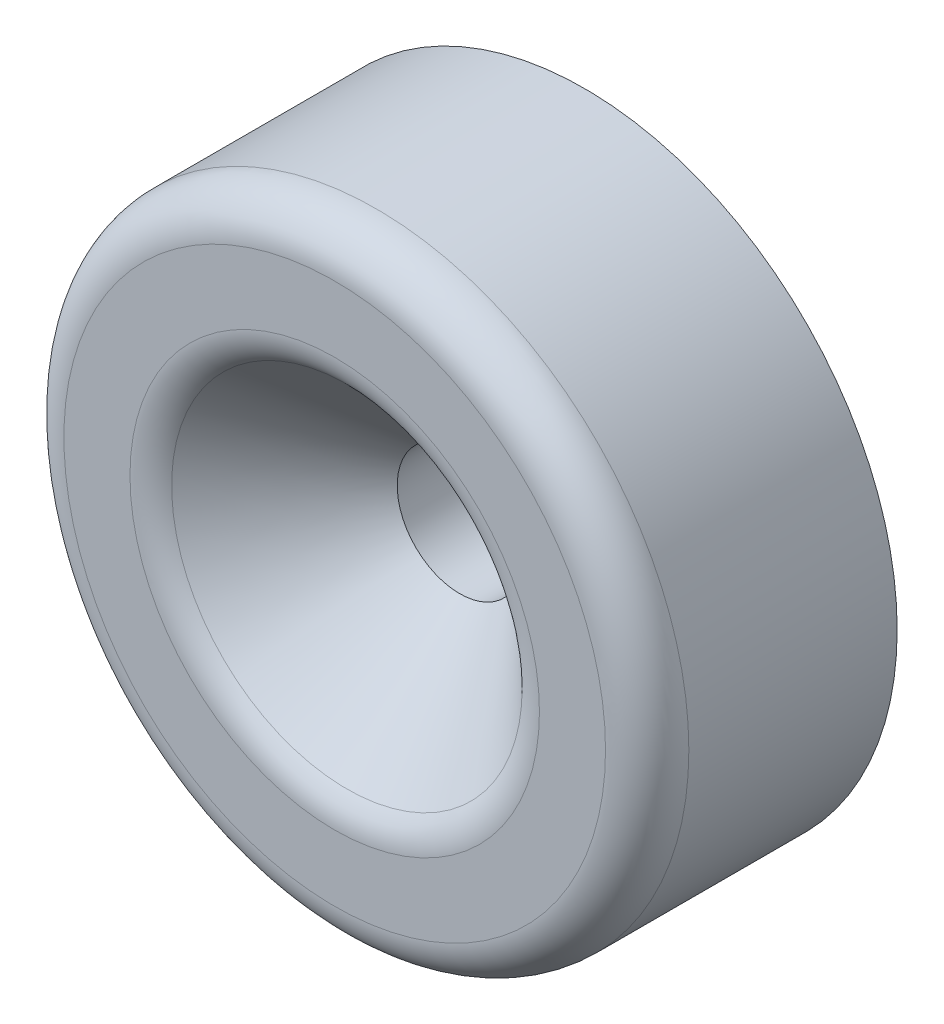
ISO-10303-21;
HEADER;
FILE_DESCRIPTION(('STEP AP214'),'2;1');
FILE_NAME('part.step','',(''),(''),'','','');
FILE_SCHEMA(('AUTOMOTIVE_DESIGN { 1 0 10303 214 1 1 1 1 }'));
ENDSEC;
DATA;
#1=APPLICATION_CONTEXT('core data for automotive mechanical design processes');
#2=APPLICATION_PROTOCOL_DEFINITION('international standard','automotive_design',2000,#1);
#3=PRODUCT_CONTEXT('',#1,'mechanical');
#4=PRODUCT('Part','Part','',(#3));
#5=PRODUCT_RELATED_PRODUCT_CATEGORY('part','',(#4));
#6=PRODUCT_DEFINITION_FORMATION('','',#4);
#7=PRODUCT_DEFINITION_CONTEXT('part definition',#1,'design');
#8=PRODUCT_DEFINITION('design','',#6,#7);
#9=PRODUCT_DEFINITION_SHAPE('','',#8);
#10=(LENGTH_UNIT() NAMED_UNIT(*) SI_UNIT(.MILLI.,.METRE.));
#11=(NAMED_UNIT(*) PLANE_ANGLE_UNIT() SI_UNIT($,.RADIAN.));
#12=(NAMED_UNIT(*) SI_UNIT($,.STERADIAN.) SOLID_ANGLE_UNIT());
#13=UNCERTAINTY_MEASURE_WITH_UNIT(LENGTH_MEASURE(1.E-05),#10,'distance_accuracy_value','');
#14=(GEOMETRIC_REPRESENTATION_CONTEXT(3) GLOBAL_UNCERTAINTY_ASSIGNED_CONTEXT((#13)) GLOBAL_UNIT_ASSIGNED_CONTEXT((#10,
#11,#12)) REPRESENTATION_CONTEXT('',''));
#15=CARTESIAN_POINT('',(0.,0.,0.));
#16=DIRECTION('',(0.,0.,1.));
#17=DIRECTION('',(1.,0.,0.));
#18=AXIS2_PLACEMENT_3D('',#15,#16,#17);
#19=CARTESIAN_POINT('',(0.,0.,12.));
#20=DIRECTION('',(0.,0.,1.));
#21=DIRECTION('',(1.,0.,0.));
#22=AXIS2_PLACEMENT_3D('',#19,#20,#21);
#23=PLANE('',#22);
#24=CARTESIAN_POINT('',(0.,0.,12.));
#25=DIRECTION('',(0.,0.,1.));
#26=DIRECTION('',(1.,0.,0.));
#27=AXIS2_PLACEMENT_3D('',#24,#25,#26);
#28=CIRCLE('',#27,13.);
#29=CARTESIAN_POINT('',(13.,0.,12.));
#30=VERTEX_POINT('',#29);
#31=EDGE_CURVE('E44',#30,#30,#28,.T.);
#32=ORIENTED_EDGE('',*,*,#31,.T.);
#33=EDGE_LOOP('',(#32));
#34=FACE_BOUND('',#33,.T.);
#35=CARTESIAN_POINT('',(0.,0.,12.));
#36=DIRECTION('',(0.,0.,1.));
#37=DIRECTION('',(1.,0.,0.));
#38=AXIS2_PLACEMENT_3D('',#35,#36,#37);
#39=CIRCLE('',#38,9.82842712474621);
#40=CARTESIAN_POINT('',(9.82842712474621,0.,12.));
#41=VERTEX_POINT('',#40);
#42=EDGE_CURVE('E48',#41,#41,#39,.F.);
#43=ORIENTED_EDGE('',*,*,#42,.T.);
#44=EDGE_LOOP('',(#43));
#45=FACE_BOUND('',#44,.T.);
#46=ADVANCED_FACE('F33',(#34,#45),#23,.T.);
#47=CARTESIAN_POINT('',(0.,0.,0.));
#48=DIRECTION('',(0.,0.,1.));
#49=DIRECTION('',(1.,0.,0.));
#50=AXIS2_PLACEMENT_3D('',#47,#48,#49);
#51=PLANE('',#50);
#52=CARTESIAN_POINT('',(0.,0.,0.));
#53=DIRECTION('',(0.,0.,1.));
#54=DIRECTION('',(1.,0.,0.));
#55=AXIS2_PLACEMENT_3D('',#52,#53,#54);
#56=CIRCLE('',#55,15.);
#57=CARTESIAN_POINT('',(15.,0.,0.));
#58=VERTEX_POINT('',#57);
#59=EDGE_CURVE('E56',#58,#58,#56,.T.);
#60=ORIENTED_EDGE('',*,*,#59,.F.);
#61=EDGE_LOOP('',(#60));
#62=FACE_BOUND('',#61,.T.);
#63=CARTESIAN_POINT('',(0.,0.,0.));
#64=DIRECTION('',(0.,0.,1.));
#65=DIRECTION('',(1.,0.,0.));
#66=AXIS2_PLACEMENT_3D('',#63,#64,#65);
#67=CIRCLE('',#66,3.);
#68=CARTESIAN_POINT('',(3.,0.,0.));
#69=VERTEX_POINT('',#68);
#70=EDGE_CURVE('E59',#69,#69,#67,.T.);
#71=ORIENTED_EDGE('',*,*,#70,.T.);
#72=EDGE_LOOP('',(#71));
#73=FACE_BOUND('',#72,.T.);
#74=ADVANCED_FACE('F63',(#62,#73),#51,.F.);
#75=CARTESIAN_POINT('',(0.,0.,12.));
#76=DIRECTION('',(0.,0.,-1.));
#77=DIRECTION('',(-1.,0.,0.));
#78=AXIS2_PLACEMENT_3D('',#75,#76,#77);
#79=CYLINDRICAL_SURFACE('',#78,15.);
#80=CARTESIAN_POINT('',(0.,0.,10.));
#81=DIRECTION('',(0.,0.,1.));
#82=DIRECTION('',(1.,0.,0.));
#83=AXIS2_PLACEMENT_3D('',#80,#81,#82);
#84=CIRCLE('',#83,15.);
#85=CARTESIAN_POINT('',(15.,0.,10.));
#86=VERTEX_POINT('',#85);
#87=EDGE_CURVE('E40',#86,#86,#84,.F.);
#88=ORIENTED_EDGE('',*,*,#87,.T.);
#89=EDGE_LOOP('',(#88));
#90=FACE_BOUND('',#89,.T.);
#91=ORIENTED_EDGE('',*,*,#59,.T.);
#92=EDGE_LOOP('',(#91));
#93=FACE_BOUND('',#92,.T.);
#94=ADVANCED_FACE('F68',(#90,#93),#79,.T.);
#95=CARTESIAN_POINT('',(0.,0.,12.));
#96=DIRECTION('',(0.,0.,-1.));
#97=DIRECTION('',(-1.,0.,0.));
#98=AXIS2_PLACEMENT_3D('',#95,#96,#97);
#99=CYLINDRICAL_SURFACE('',#98,3.);
#100=CARTESIAN_POINT('',(0.,0.,6.));
#101=DIRECTION('',(0.,0.,1.));
#102=DIRECTION('',(1.,0.,0.));
#103=AXIS2_PLACEMENT_3D('',#100,#101,#102);
#104=CIRCLE('',#103,3.);
#105=CARTESIAN_POINT('',(3.,0.,6.));
#106=VERTEX_POINT('',#105);
#107=EDGE_CURVE('E53',#106,#106,#104,.T.);
#108=ORIENTED_EDGE('',*,*,#107,.T.);
#109=EDGE_LOOP('',(#108));
#110=FACE_BOUND('',#109,.T.);
#111=ORIENTED_EDGE('',*,*,#70,.F.);
#112=EDGE_LOOP('',(#111));
#113=FACE_BOUND('',#112,.T.);
#114=ADVANCED_FACE('F65',(#110,#113),#99,.F.);
#115=CARTESIAN_POINT('',(0.,0.,6.));
#116=DIRECTION('',(0.,0.,1.));
#117=DIRECTION('',(1.,0.,0.));
#118=AXIS2_PLACEMENT_3D('',#115,#116,#117);
#119=CONICAL_SURFACE('',#118,3.,0.78539816339745);
#120=CARTESIAN_POINT('',(0.,0.,11.4142135623731));
#121=DIRECTION('',(0.,0.,-1.));
#122=DIRECTION('',(-1.,0.,0.));
#123=AXIS2_PLACEMENT_3D('',#120,#121,#122);
#124=CIRCLE('',#123,8.41421356237312);
#125=CARTESIAN_POINT('',(8.41421356237312,0.,11.4142135623731));
#126=VERTEX_POINT('',#125);
#127=EDGE_CURVE('E10',#126,#126,#124,.F.);
#128=CARTESIAN_POINT('',(8.41421356237312,0.,11.4142135623731));
#129=CARTESIAN_POINT('',(8.35781550443173,0.,11.3578155044317));
#130=CARTESIAN_POINT('',(8.30141744649034,0.,11.3014174464903));
#131=CARTESIAN_POINT('',(8.18862133060757,0.,11.1886213306076));
#132=CARTESIAN_POINT('',(8.13222327266619,0.,11.1322232726662));
#133=CARTESIAN_POINT('',(8.01942715678341,0.,11.0194271567834));
#134=CARTESIAN_POINT('',(7.96302909884202,0.,10.963029098842));
#135=CARTESIAN_POINT('',(7.85023298295925,0.,10.8502329829592));
#136=CARTESIAN_POINT('',(7.79383492501787,0.,10.7938349250178));
#137=CARTESIAN_POINT('',(7.68103880913509,0.,10.6810388091351));
#138=CARTESIAN_POINT('',(7.62464075119371,0.,10.6246407511937));
#139=CARTESIAN_POINT('',(7.51184463531093,0.,10.5118446353109));
#140=CARTESIAN_POINT('',(7.45544657736955,0.,10.4554465773695));
#141=CARTESIAN_POINT('',(7.34265046148677,0.,10.3426504614868));
#142=CARTESIAN_POINT('',(7.28625240354538,0.,10.2862524035454));
#143=CARTESIAN_POINT('',(7.17345628766261,0.,10.1734562876626));
#144=CARTESIAN_POINT('',(7.11705822972122,0.,10.1170582297212));
#145=CARTESIAN_POINT('',(7.00426211383845,0.,10.0042621138384));
#146=CARTESIAN_POINT('',(6.94786405589707,0.,9.94786405589705));
#147=CARTESIAN_POINT('',(6.83506794001429,0.,9.83506794001428));
#148=CARTESIAN_POINT('',(6.77866988207291,0.,9.77866988207289));
#149=CARTESIAN_POINT('',(6.66587376619013,0.,9.66587376619012));
#150=CARTESIAN_POINT('',(6.60947570824875,0.,9.60947570824873));
#151=CARTESIAN_POINT('',(6.49667959236597,0.,9.49667959236596));
#152=CARTESIAN_POINT('',(6.44028153442459,0.,9.44028153442457));
#153=CARTESIAN_POINT('',(6.32748541854181,0.,9.3274854185418));
#154=CARTESIAN_POINT('',(6.27108736060043,0.,9.27108736060041));
#155=CARTESIAN_POINT('',(6.15829124471765,0.,9.15829124471764));
#156=CARTESIAN_POINT('',(6.10189318677627,0.,9.10189318677625));
#157=CARTESIAN_POINT('',(5.98909707089349,0.,8.98909707089348));
#158=CARTESIAN_POINT('',(5.93269901295211,0.,8.93269901295209));
#159=CARTESIAN_POINT('',(5.81990289706933,0.,8.81990289706932));
#160=CARTESIAN_POINT('',(5.76350483912795,0.,8.76350483912793));
#161=CARTESIAN_POINT('',(5.65070872324517,0.,8.65070872324516));
#162=CARTESIAN_POINT('',(5.59431066530379,0.,8.59431066530377));
#163=CARTESIAN_POINT('',(5.48151454942101,0.,8.481514549421));
#164=CARTESIAN_POINT('',(5.42511649147963,0.,8.42511649147962));
#165=CARTESIAN_POINT('',(5.31232037559685,0.,8.31232037559684));
#166=CARTESIAN_POINT('',(5.25592231765547,0.,8.25592231765546));
#167=CARTESIAN_POINT('',(5.14312620177269,0.,8.14312620177268));
#168=CARTESIAN_POINT('',(5.08672814383131,0.,8.0867281438313));
#169=CARTESIAN_POINT('',(4.97393202794853,0.,7.97393202794852));
#170=CARTESIAN_POINT('',(4.91753397000715,0.,7.91753397000714));
#171=CARTESIAN_POINT('',(4.80473785412437,0.,7.80473785412437));
#172=CARTESIAN_POINT('',(4.74833979618299,0.,7.74833979618298));
#173=CARTESIAN_POINT('',(4.63554368030021,0.,7.63554368030021));
#174=CARTESIAN_POINT('',(4.57914562235883,0.,7.57914562235882));
#175=CARTESIAN_POINT('',(4.46634950647605,0.,7.46634950647605));
#176=CARTESIAN_POINT('',(4.40995144853467,0.,7.40995144853466));
#177=CARTESIAN_POINT('',(4.29715533265189,0.,7.29715533265189));
#178=CARTESIAN_POINT('',(4.24075727471051,0.,7.2407572747105));
#179=CARTESIAN_POINT('',(4.12796115882773,0.,7.12796115882773));
#180=CARTESIAN_POINT('',(4.07156310088635,0.,7.07156310088634));
#181=CARTESIAN_POINT('',(3.95876698500357,0.,6.95876698500357));
#182=CARTESIAN_POINT('',(3.90236892706219,0.,6.90236892706218));
#183=CARTESIAN_POINT('',(3.78957281117941,0.,6.78957281117941));
#184=CARTESIAN_POINT('',(3.73317475323803,0.,6.73317475323802));
#185=CARTESIAN_POINT('',(3.62037863735525,0.,6.62037863735525));
#186=CARTESIAN_POINT('',(3.56398057941387,0.,6.56398057941386));
#187=CARTESIAN_POINT('',(3.45118446353109,0.,6.45118446353109));
#188=CARTESIAN_POINT('',(3.39478640558971,0.,6.3947864055897));
#189=CARTESIAN_POINT('',(3.28199028970693,0.,6.28199028970693));
#190=CARTESIAN_POINT('',(3.22559223176555,0.,6.22559223176554));
#191=CARTESIAN_POINT('',(3.11279611588277,0.,6.11279611588277));
#192=CARTESIAN_POINT('',(3.05639805794139,0.,6.05639805794138));
#193=CARTESIAN_POINT('',(3.,0.,6.));
#194=B_SPLINE_CURVE_WITH_KNOTS('',3,(#128,#129,#130,#131,#132,#133,#134,#135,#136,#137,#138,
#139,#140,#141,#142,#143,#144,#145,#146,#147,#148,#149,#150,#151,#152,#153,#154,#155,#156,#157,
#158,#159,#160,#161,#162,#163,#164,#165,#166,#167,#168,#169,#170,#171,#172,#173,#174,#175,#176,
#177,#178,#179,#180,#181,#182,#183,#184,#185,#186,#187,#188,#189,#190,#191,#192,#193),
.UNSPECIFIED.,.F.,.F.,(4,2,2,2,2,2,2,2,2,2,2,2,2,2,2,2,2,2,2,2,2,2,2,2,2,2,2,2,2,2,2,2,4),(0.,
0.239276695296638,0.478553390593275,0.717830085889913,0.957106781186551,1.19638347648319,
1.43566017177983,1.67493686707646,1.9142135623731,2.15349025766974,2.39276695296638,
2.63204364826301,2.87132034355965,3.11059703885629,3.34987373415293,3.58915042944956,
3.8284271247462,4.06770382004284,4.30698051533948,4.54625721063611,4.78553390593275,
5.02481060122939,5.26408729652603,5.50336399182266,5.7426406871193,5.98191738241594,
6.22119407771258,6.46047077300921,6.69974746830585,6.93902416360249,7.17830085889913,
7.41757755419576,7.6568542494924),.UNSPECIFIED.);
#195=EDGE_CURVE('BSEAM67',#126,#106,#194,.T.);
#196=ORIENTED_EDGE('',*,*,#127,.T.);
#197=ORIENTED_EDGE('',*,*,#107,.F.);
#198=ORIENTED_EDGE('',*,*,#195,.T.);
#199=ORIENTED_EDGE('',*,*,#195,.F.);
#200=EDGE_LOOP('',(#196,#198,#197,#199));
#201=FACE_BOUND('',#200,.T.);
#202=ADVANCED_FACE('F67',(#201),#119,.F.);
#203=CARTESIAN_POINT('',(0.,0.,10.));
#204=DIRECTION('',(0.,0.,1.));
#205=DIRECTION('',(1.,0.,0.));
#206=AXIS2_PLACEMENT_3D('',#203,#204,#205);
#207=TOROIDAL_SURFACE('',#206,13.,2.);
#208=ORIENTED_EDGE('',*,*,#87,.F.);
#209=EDGE_LOOP('',(#208));
#210=FACE_BOUND('',#209,.T.);
#211=ORIENTED_EDGE('',*,*,#31,.F.);
#212=EDGE_LOOP('',(#211));
#213=FACE_BOUND('',#212,.T.);
#214=ADVANCED_FACE('F75',(#210,#213),#207,.T.);
#215=CARTESIAN_POINT('',(0.,0.,10.));
#216=DIRECTION('',(0.,0.,1.));
#217=DIRECTION('',(1.,0.,0.));
#218=AXIS2_PLACEMENT_3D('',#215,#216,#217);
#219=TOROIDAL_SURFACE('',#218,9.82842712474621,2.);
#220=ORIENTED_EDGE('',*,*,#127,.F.);
#221=EDGE_LOOP('',(#220));
#222=FACE_BOUND('',#221,.T.);
#223=ORIENTED_EDGE('',*,*,#42,.F.);
#224=EDGE_LOOP('',(#223));
#225=FACE_BOUND('',#224,.T.);
#226=ADVANCED_FACE('F35',(#222,#225),#219,.T.);
#227=CLOSED_SHELL('',(#46,#74,#94,#114,#202,#214,#226));
#228=MANIFOLD_SOLID_BREP('B2',#227);
#229=ADVANCED_BREP_SHAPE_REPRESENTATION('',(#18,#228),#14);
#230=SHAPE_DEFINITION_REPRESENTATION(#9,#229);
ENDSEC;
END-ISO-10303-21;
